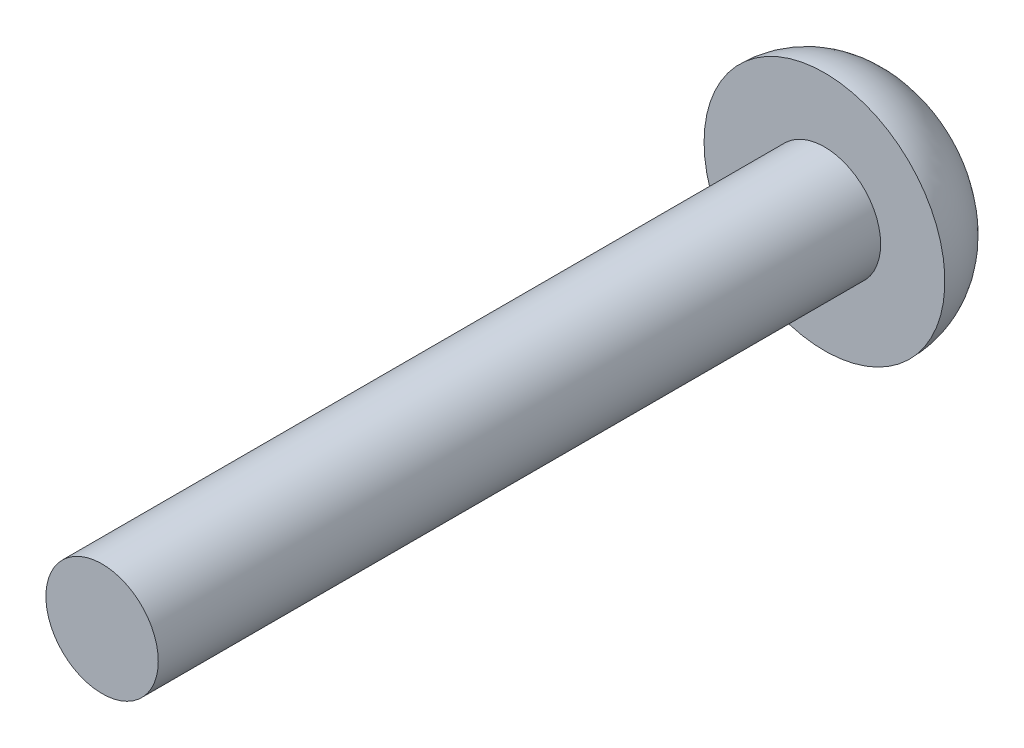
ISO-10303-21;
HEADER;
FILE_DESCRIPTION(('STEP AP214'),'2;1');
FILE_NAME('part.step','',(''),(''),'','','');
FILE_SCHEMA(('AUTOMOTIVE_DESIGN { 1 0 10303 214 1 1 1 1 }'));
ENDSEC;
DATA;
#1=APPLICATION_CONTEXT('core data for automotive mechanical design processes');
#2=APPLICATION_PROTOCOL_DEFINITION('international standard','automotive_design',2000,#1);
#3=PRODUCT_CONTEXT('',#1,'mechanical');
#4=PRODUCT('Part','Part','',(#3));
#5=PRODUCT_RELATED_PRODUCT_CATEGORY('part','',(#4));
#6=PRODUCT_DEFINITION_FORMATION('','',#4);
#7=PRODUCT_DEFINITION_CONTEXT('part definition',#1,'design');
#8=PRODUCT_DEFINITION('design','',#6,#7);
#9=PRODUCT_DEFINITION_SHAPE('','',#8);
#10=(LENGTH_UNIT() NAMED_UNIT(*) SI_UNIT(.MILLI.,.METRE.));
#11=(NAMED_UNIT(*) PLANE_ANGLE_UNIT() SI_UNIT($,.RADIAN.));
#12=(NAMED_UNIT(*) SI_UNIT($,.STERADIAN.) SOLID_ANGLE_UNIT());
#13=UNCERTAINTY_MEASURE_WITH_UNIT(LENGTH_MEASURE(1.E-05),#10,'distance_accuracy_value','');
#14=(GEOMETRIC_REPRESENTATION_CONTEXT(3) GLOBAL_UNCERTAINTY_ASSIGNED_CONTEXT((#13)) GLOBAL_UNIT_ASSIGNED_CONTEXT((#10,
#11,#12)) REPRESENTATION_CONTEXT('',''));
#15=CARTESIAN_POINT('',(0.,0.,0.));
#16=DIRECTION('',(0.,0.,1.));
#17=DIRECTION('',(1.,0.,0.));
#18=AXIS2_PLACEMENT_3D('',#15,#16,#17);
#19=CARTESIAN_POINT('',(0.,0.,18.));
#20=DIRECTION('',(0.,0.,-1.));
#21=DIRECTION('',(-1.,0.,0.));
#22=AXIS2_PLACEMENT_3D('',#19,#20,#21);
#23=CYLINDRICAL_SURFACE('',#22,1.4);
#24=CARTESIAN_POINT('',(0.,0.,18.));
#25=DIRECTION('',(0.,0.,1.));
#26=DIRECTION('',(1.,0.,0.));
#27=AXIS2_PLACEMENT_3D('',#24,#25,#26);
#28=CIRCLE('',#27,1.4);
#29=CARTESIAN_POINT('',(1.4,0.,18.));
#30=VERTEX_POINT('',#29);
#31=EDGE_CURVE('E39',#30,#30,#28,.T.);
#32=ORIENTED_EDGE('',*,*,#31,.F.);
#33=EDGE_LOOP('',(#32));
#34=FACE_BOUND('',#33,.T.);
#35=CARTESIAN_POINT('',(0.,0.,0.));
#36=DIRECTION('',(0.,0.,1.));
#37=DIRECTION('',(1.,0.,0.));
#38=AXIS2_PLACEMENT_3D('',#35,#36,#37);
#39=CIRCLE('',#38,1.4);
#40=CARTESIAN_POINT('',(1.4,0.,0.));
#41=VERTEX_POINT('',#40);
#42=EDGE_CURVE('E43',#41,#41,#39,.T.);
#43=ORIENTED_EDGE('',*,*,#42,.T.);
#44=EDGE_LOOP('',(#43));
#45=FACE_BOUND('',#44,.T.);
#46=ADVANCED_FACE('F32',(#34,#45),#23,.T.);
#47=CARTESIAN_POINT('',(0.,0.,18.));
#48=DIRECTION('',(0.,0.,1.));
#49=DIRECTION('',(1.,0.,0.));
#50=AXIS2_PLACEMENT_3D('',#47,#48,#49);
#51=PLANE('',#50);
#52=ORIENTED_EDGE('',*,*,#31,.T.);
#53=EDGE_LOOP('',(#52));
#54=FACE_BOUND('',#53,.T.);
#55=ADVANCED_FACE('F64',(#54),#51,.T.);
#56=CARTESIAN_POINT('',(0.,0.,-2.));
#57=DIRECTION('',(0.,0.,-1.));
#58=DIRECTION('',(-1.,0.,0.));
#59=AXIS2_PLACEMENT_3D('',#56,#57,#58);
#60=PLANE('',#59);
#61=CARTESIAN_POINT('',(0.,0.,-2.));
#62=DIRECTION('',(0.,0.,-1.));
#63=DIRECTION('',(-1.,0.,0.));
#64=AXIS2_PLACEMENT_3D('',#61,#62,#63);
#65=CIRCLE('',#64,1.);
#66=CARTESIAN_POINT('',(-1.,0.,-2.));
#67=VERTEX_POINT('',#66);
#68=EDGE_CURVE('E10',#67,#67,#65,.T.);
#69=ORIENTED_EDGE('',*,*,#68,.T.);
#70=EDGE_LOOP('',(#69));
#71=FACE_BOUND('',#70,.T.);
#72=ADVANCED_FACE('F57',(#71),#60,.T.);
#73=CARTESIAN_POINT('',(0.,0.,0.));
#74=DIRECTION('',(0.,0.,-1.));
#75=DIRECTION('',(-1.,0.,0.));
#76=AXIS2_PLACEMENT_3D('',#73,#74,#75);
#77=PLANE('',#76);
#78=ORIENTED_EDGE('',*,*,#42,.F.);
#79=EDGE_LOOP('',(#78));
#80=FACE_BOUND('',#79,.T.);
#81=CARTESIAN_POINT('',(0.,0.,0.));
#82=DIRECTION('',(0.,0.,-1.));
#83=DIRECTION('',(-1.,0.,0.));
#84=AXIS2_PLACEMENT_3D('',#81,#82,#83);
#85=CIRCLE('',#84,3.);
#86=CARTESIAN_POINT('',(-3.,0.,0.));
#87=VERTEX_POINT('',#86);
#88=EDGE_CURVE('E48',#87,#87,#85,.T.);
#89=ORIENTED_EDGE('',*,*,#88,.F.);
#90=EDGE_LOOP('',(#89));
#91=FACE_BOUND('',#90,.T.);
#92=ADVANCED_FACE('F55',(#80,#91),#77,.F.);
#93=CARTESIAN_POINT('',(0.,0.,0.));
#94=DIRECTION('',(0.,0.,-1.));
#95=DIRECTION('',(-1.,0.,0.));
#96=AXIS2_PLACEMENT_3D('',#93,#94,#95);
#97=DEGENERATE_TOROIDAL_SURFACE('',#96,1.,2.,.T.);
#98=ORIENTED_EDGE('',*,*,#88,.T.);
#99=EDGE_LOOP('',(#98));
#100=FACE_BOUND('',#99,.T.);
#101=ORIENTED_EDGE('',*,*,#68,.F.);
#102=EDGE_LOOP('',(#101));
#103=FACE_BOUND('',#102,.T.);
#104=ADVANCED_FACE('F34',(#100,#103),#97,.T.);
#105=CLOSED_SHELL('',(#46,#55,#72,#92,#104));
#106=MANIFOLD_SOLID_BREP('B2',#105);
#107=ADVANCED_BREP_SHAPE_REPRESENTATION('',(#18,#106),#14);
#108=SHAPE_DEFINITION_REPRESENTATION(#9,#107);
ENDSEC;
END-ISO-10303-21;
